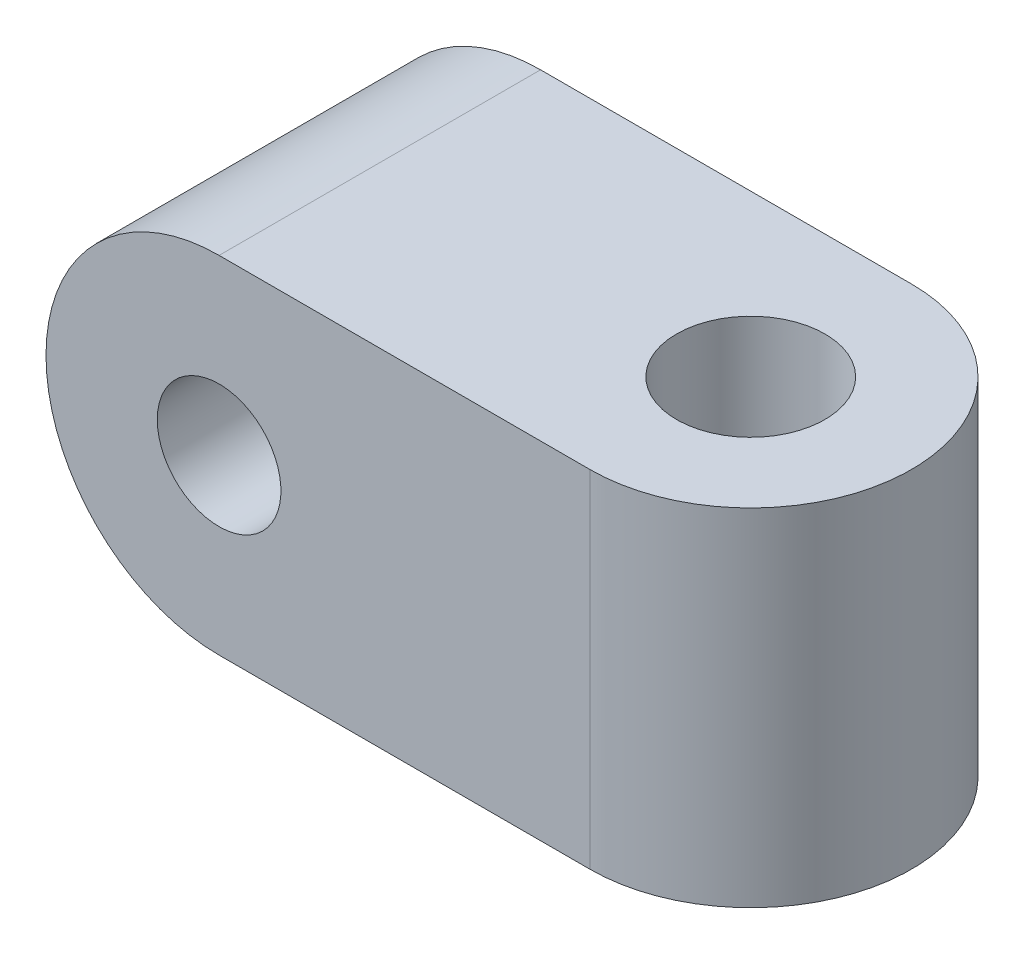
ISO-10303-21;
HEADER;
FILE_DESCRIPTION(('STEP AP214'),'2;1');
FILE_NAME('part.step','',(''),(''),'','','');
FILE_SCHEMA(('AUTOMOTIVE_DESIGN { 1 0 10303 214 1 1 1 1 }'));
ENDSEC;
DATA;
#1=APPLICATION_CONTEXT('core data for automotive mechanical design processes');
#2=APPLICATION_PROTOCOL_DEFINITION('international standard','automotive_design',2000,#1);
#3=PRODUCT_CONTEXT('',#1,'mechanical');
#4=PRODUCT('Part','Part','',(#3));
#5=PRODUCT_RELATED_PRODUCT_CATEGORY('part','',(#4));
#6=PRODUCT_DEFINITION_FORMATION('','',#4);
#7=PRODUCT_DEFINITION_CONTEXT('part definition',#1,'design');
#8=PRODUCT_DEFINITION('design','',#6,#7);
#9=PRODUCT_DEFINITION_SHAPE('','',#8);
#10=(LENGTH_UNIT() NAMED_UNIT(*) SI_UNIT(.MILLI.,.METRE.));
#11=(NAMED_UNIT(*) PLANE_ANGLE_UNIT() SI_UNIT($,.RADIAN.));
#12=(NAMED_UNIT(*) SI_UNIT($,.STERADIAN.) SOLID_ANGLE_UNIT());
#13=UNCERTAINTY_MEASURE_WITH_UNIT(LENGTH_MEASURE(1.E-05),#10,'distance_accuracy_value','');
#14=(GEOMETRIC_REPRESENTATION_CONTEXT(3) GLOBAL_UNCERTAINTY_ASSIGNED_CONTEXT((#13)) GLOBAL_UNIT_ASSIGNED_CONTEXT((#10,
#11,#12)) REPRESENTATION_CONTEXT('',''));
#15=CARTESIAN_POINT('',(0.,0.,0.));
#16=DIRECTION('',(0.,0.,1.));
#17=DIRECTION('',(1.,0.,0.));
#18=AXIS2_PLACEMENT_3D('',#15,#16,#17);
#19=CARTESIAN_POINT('',(0.,0.,6.5));
#20=DIRECTION('',(0.,0.,-1.));
#21=DIRECTION('',(-1.,0.,0.));
#22=AXIS2_PLACEMENT_3D('',#19,#20,#21);
#23=CYLINDRICAL_SURFACE('',#22,3.5);
#24=CARTESIAN_POINT('',(0.,0.,0.));
#25=DIRECTION('',(0.,0.,1.));
#26=DIRECTION('',(1.,0.,0.));
#27=AXIS2_PLACEMENT_3D('',#24,#25,#26);
#28=CIRCLE('',#27,3.5);
#29=CARTESIAN_POINT('',(0.,3.5,0.));
#30=VERTEX_POINT('',#29);
#31=CARTESIAN_POINT('',(0.,-3.5,0.));
#32=VERTEX_POINT('',#31);
#33=EDGE_CURVE('E93',#30,#32,#28,.T.);
#34=ORIENTED_EDGE('',*,*,#33,.T.);
#35=DIRECTION('',(0.,0.,-1.));
#36=VECTOR('',#35,1.);
#37=CARTESIAN_POINT('',(0.,-3.5,6.5));
#38=LINE('',#37,#36);
#39=CARTESIAN_POINT('',(0.,-3.5,6.5));
#40=VERTEX_POINT('',#39);
#41=EDGE_CURVE('E13',#40,#32,#38,.T.);
#42=ORIENTED_EDGE('',*,*,#41,.F.);
#43=CARTESIAN_POINT('',(0.,0.,6.5));
#44=DIRECTION('',(0.,0.,1.));
#45=DIRECTION('',(1.,0.,0.));
#46=AXIS2_PLACEMENT_3D('',#43,#44,#45);
#47=CIRCLE('',#46,3.5);
#48=CARTESIAN_POINT('',(0.,3.5,6.5));
#49=VERTEX_POINT('',#48);
#50=EDGE_CURVE('E122',#49,#40,#47,.T.);
#51=ORIENTED_EDGE('',*,*,#50,.F.);
#52=DIRECTION('',(0.,0.,-1.));
#53=VECTOR('',#52,1.);
#54=CARTESIAN_POINT('',(0.,3.5,6.5));
#55=LINE('',#54,#53);
#56=EDGE_CURVE('E55',#49,#30,#55,.T.);
#57=ORIENTED_EDGE('',*,*,#56,.T.);
#58=EDGE_LOOP('',(#34,#42,#51,#57));
#59=FACE_BOUND('',#58,.T.);
#60=ADVANCED_FACE('F46',(#59),#23,.T.);
#61=CARTESIAN_POINT('',(0.,-3.5,6.5));
#62=DIRECTION('',(0.,-1.,0.));
#63=DIRECTION('',(1.,0.,0.));
#64=AXIS2_PLACEMENT_3D('',#61,#62,#63);
#65=PLANE('',#64);
#66=DIRECTION('',(-1.,0.,0.));
#67=VECTOR('',#66,1.);
#68=CARTESIAN_POINT('',(0.,-3.5,0.));
#69=LINE('',#68,#67);
#70=CARTESIAN_POINT('',(7.5,-3.5,0.));
#71=VERTEX_POINT('',#70);
#72=EDGE_CURVE('E78',#71,#32,#69,.T.);
#73=ORIENTED_EDGE('',*,*,#72,.F.);
#74=CARTESIAN_POINT('',(7.5,-3.5,3.25));
#75=DIRECTION('',(0.,1.,0.));
#76=DIRECTION('',(-1.,0.,0.));
#77=AXIS2_PLACEMENT_3D('',#74,#75,#76);
#78=CIRCLE('',#77,3.25);
#79=CARTESIAN_POINT('',(7.5,-3.5,6.5));
#80=VERTEX_POINT('',#79);
#81=EDGE_CURVE('E102',#80,#71,#78,.T.);
#82=ORIENTED_EDGE('',*,*,#81,.F.);
#83=DIRECTION('',(-1.,0.,0.));
#84=VECTOR('',#83,1.);
#85=CARTESIAN_POINT('',(0.,-3.5,6.5));
#86=LINE('',#85,#84);
#87=EDGE_CURVE('E124',#80,#40,#86,.T.);
#88=ORIENTED_EDGE('',*,*,#87,.T.);
#89=ORIENTED_EDGE('',*,*,#41,.T.);
#90=EDGE_LOOP('',(#73,#82,#88,#89));
#91=FACE_BOUND('',#90,.T.);
#92=CARTESIAN_POINT('',(7.5,-3.5,3.25));
#93=DIRECTION('',(0.,1.,0.));
#94=DIRECTION('',(-1.,0.,0.));
#95=AXIS2_PLACEMENT_3D('',#92,#93,#94);
#96=CIRCLE('',#95,1.5);
#97=CARTESIAN_POINT('',(6.,-3.5,3.25));
#98=VERTEX_POINT('',#97);
#99=EDGE_CURVE('E116',#98,#98,#96,.T.);
#100=ORIENTED_EDGE('',*,*,#99,.T.);
#101=EDGE_LOOP('',(#100));
#102=FACE_BOUND('',#101,.T.);
#103=ADVANCED_FACE('F133',(#91,#102),#65,.T.);
#104=CARTESIAN_POINT('',(0.,0.,6.5));
#105=DIRECTION('',(0.,0.,-1.));
#106=DIRECTION('',(-1.,0.,0.));
#107=AXIS2_PLACEMENT_3D('',#104,#105,#106);
#108=CYLINDRICAL_SURFACE('',#107,1.25);
#109=CARTESIAN_POINT('',(0.,0.,6.5));
#110=DIRECTION('',(0.,0.,1.));
#111=DIRECTION('',(1.,0.,0.));
#112=AXIS2_PLACEMENT_3D('',#109,#110,#111);
#113=CIRCLE('',#112,1.25);
#114=CARTESIAN_POINT('',(-1.25,0.,6.5));
#115=VERTEX_POINT('',#114);
#116=EDGE_CURVE('E95',#115,#115,#113,.T.);
#117=CARTESIAN_POINT('',(0.,0.,0.));
#118=DIRECTION('',(0.,0.,1.));
#119=DIRECTION('',(1.,0.,0.));
#120=AXIS2_PLACEMENT_3D('',#117,#118,#119);
#121=CIRCLE('',#120,1.25);
#122=CARTESIAN_POINT('',(-1.25,0.,0.));
#123=VERTEX_POINT('',#122);
#124=EDGE_CURVE('E103',#123,#123,#121,.T.);
#125=CARTESIAN_POINT('',(-1.25,0.,6.5));
#126=CARTESIAN_POINT('',(-1.25,0.,6.43229166666667));
#127=CARTESIAN_POINT('',(-1.25,0.,6.36458333333333));
#128=CARTESIAN_POINT('',(-1.25,0.,6.22916666666667));
#129=CARTESIAN_POINT('',(-1.25,0.,6.16145833333333));
#130=CARTESIAN_POINT('',(-1.25,0.,6.02604166666667));
#131=CARTESIAN_POINT('',(-1.25,0.,5.95833333333333));
#132=CARTESIAN_POINT('',(-1.25,0.,5.82291666666667));
#133=CARTESIAN_POINT('',(-1.25,0.,5.75520833333333));
#134=CARTESIAN_POINT('',(-1.25,0.,5.61979166666667));
#135=CARTESIAN_POINT('',(-1.25,0.,5.55208333333333));
#136=CARTESIAN_POINT('',(-1.25,0.,5.41666666666667));
#137=CARTESIAN_POINT('',(-1.25,0.,5.34895833333333));
#138=CARTESIAN_POINT('',(-1.25,0.,5.21354166666667));
#139=CARTESIAN_POINT('',(-1.25,0.,5.14583333333333));
#140=CARTESIAN_POINT('',(-1.25,0.,5.01041666666667));
#141=CARTESIAN_POINT('',(-1.25,0.,4.94270833333333));
#142=CARTESIAN_POINT('',(-1.25,0.,4.80729166666667));
#143=CARTESIAN_POINT('',(-1.25,0.,4.73958333333333));
#144=CARTESIAN_POINT('',(-1.25,0.,4.60416666666667));
#145=CARTESIAN_POINT('',(-1.25,0.,4.53645833333333));
#146=CARTESIAN_POINT('',(-1.25,0.,4.40104166666667));
#147=CARTESIAN_POINT('',(-1.25,0.,4.33333333333333));
#148=CARTESIAN_POINT('',(-1.25,0.,4.19791666666667));
#149=CARTESIAN_POINT('',(-1.25,0.,4.13020833333333));
#150=CARTESIAN_POINT('',(-1.25,0.,3.99479166666667));
#151=CARTESIAN_POINT('',(-1.25,0.,3.92708333333333));
#152=CARTESIAN_POINT('',(-1.25,0.,3.79166666666667));
#153=CARTESIAN_POINT('',(-1.25,0.,3.72395833333333));
#154=CARTESIAN_POINT('',(-1.25,0.,3.58854166666667));
#155=CARTESIAN_POINT('',(-1.25,0.,3.52083333333333));
#156=CARTESIAN_POINT('',(-1.25,0.,3.38541666666667));
#157=CARTESIAN_POINT('',(-1.25,0.,3.31770833333333));
#158=CARTESIAN_POINT('',(-1.25,0.,3.18229166666667));
#159=CARTESIAN_POINT('',(-1.25,0.,3.11458333333333));
#160=CARTESIAN_POINT('',(-1.25,0.,2.97916666666667));
#161=CARTESIAN_POINT('',(-1.25,0.,2.91145833333333));
#162=CARTESIAN_POINT('',(-1.25,0.,2.77604166666667));
#163=CARTESIAN_POINT('',(-1.25,0.,2.70833333333333));
#164=CARTESIAN_POINT('',(-1.25,0.,2.57291666666667));
#165=CARTESIAN_POINT('',(-1.25,0.,2.50520833333333));
#166=CARTESIAN_POINT('',(-1.25,0.,2.36979166666667));
#167=CARTESIAN_POINT('',(-1.25,0.,2.30208333333333));
#168=CARTESIAN_POINT('',(-1.25,0.,2.16666666666667));
#169=CARTESIAN_POINT('',(-1.25,0.,2.09895833333333));
#170=CARTESIAN_POINT('',(-1.25,0.,1.96354166666667));
#171=CARTESIAN_POINT('',(-1.25,0.,1.89583333333333));
#172=CARTESIAN_POINT('',(-1.25,0.,1.76041666666667));
#173=CARTESIAN_POINT('',(-1.25,0.,1.69270833333333));
#174=CARTESIAN_POINT('',(-1.25,0.,1.55729166666667));
#175=CARTESIAN_POINT('',(-1.25,0.,1.48958333333333));
#176=CARTESIAN_POINT('',(-1.25,0.,1.35416666666667));
#177=CARTESIAN_POINT('',(-1.25,0.,1.28645833333333));
#178=CARTESIAN_POINT('',(-1.25,0.,1.15104166666667));
#179=CARTESIAN_POINT('',(-1.25,0.,1.08333333333333));
#180=CARTESIAN_POINT('',(-1.25,0.,0.947916666666667));
#181=CARTESIAN_POINT('',(-1.25,0.,0.880208333333333));
#182=CARTESIAN_POINT('',(-1.25,0.,0.744791666666667));
#183=CARTESIAN_POINT('',(-1.25,0.,0.677083333333333));
#184=CARTESIAN_POINT('',(-1.25,0.,0.541666666666667));
#185=CARTESIAN_POINT('',(-1.25,0.,0.473958333333333));
#186=CARTESIAN_POINT('',(-1.25,0.,0.338541666666667));
#187=CARTESIAN_POINT('',(-1.25,0.,0.270833333333334));
#188=CARTESIAN_POINT('',(-1.25,0.,0.135416666666667));
#189=CARTESIAN_POINT('',(-1.25,0.,0.0677083333333334));
#190=CARTESIAN_POINT('',(-1.25,0.,0.));
#191=B_SPLINE_CURVE_WITH_KNOTS('',3,(#125,#126,#127,#128,#129,#130,#131,#132,#133,#134,#135,
#136,#137,#138,#139,#140,#141,#142,#143,#144,#145,#146,#147,#148,#149,#150,#151,#152,#153,#154,
#155,#156,#157,#158,#159,#160,#161,#162,#163,#164,#165,#166,#167,#168,#169,#170,#171,#172,#173,
#174,#175,#176,#177,#178,#179,#180,#181,#182,#183,#184,#185,#186,#187,#188,#189,#190),
.UNSPECIFIED.,.F.,.F.,(4,2,2,2,2,2,2,2,2,2,2,2,2,2,2,2,2,2,2,2,2,2,2,2,2,2,2,2,2,2,2,2,4),(0.,
0.203124999999999,0.40625,0.609375,0.812499999999999,1.015625,1.21875,1.421875,1.625,1.828125,
2.03125,2.234375,2.4375,2.640625,2.84375,3.046875,3.25,3.453125,3.65625,3.859375,4.0625,
4.265625,4.46875,4.671875,4.875,5.078125,5.28125,5.484375,5.6875,5.890625,6.09375,6.296875,6.5),.UNSPECIFIED.);
#192=EDGE_CURVE('BSEAM48',#115,#123,#191,.T.);
#193=ORIENTED_EDGE('',*,*,#116,.T.);
#194=ORIENTED_EDGE('',*,*,#124,.F.);
#195=ORIENTED_EDGE('',*,*,#192,.T.);
#196=ORIENTED_EDGE('',*,*,#192,.F.);
#197=EDGE_LOOP('',(#193,#195,#194,#196));
#198=FACE_BOUND('',#197,.T.);
#199=ADVANCED_FACE('F48',(#198),#108,.F.);
#200=CARTESIAN_POINT('',(0.,3.5,6.5));
#201=DIRECTION('',(0.,1.,0.));
#202=DIRECTION('',(-1.,0.,0.));
#203=AXIS2_PLACEMENT_3D('',#200,#201,#202);
#204=PLANE('',#203);
#205=DIRECTION('',(1.,0.,0.));
#206=VECTOR('',#205,1.);
#207=CARTESIAN_POINT('',(0.,3.5,0.));
#208=LINE('',#207,#206);
#209=CARTESIAN_POINT('',(7.5,3.5,0.));
#210=VERTEX_POINT('',#209);
#211=EDGE_CURVE('E88',#30,#210,#208,.T.);
#212=ORIENTED_EDGE('',*,*,#211,.F.);
#213=ORIENTED_EDGE('',*,*,#56,.F.);
#214=DIRECTION('',(1.,0.,0.));
#215=VECTOR('',#214,1.);
#216=CARTESIAN_POINT('',(0.,3.5,6.5));
#217=LINE('',#216,#215);
#218=CARTESIAN_POINT('',(7.5,3.5,6.5));
#219=VERTEX_POINT('',#218);
#220=EDGE_CURVE('E109',#49,#219,#217,.T.);
#221=ORIENTED_EDGE('',*,*,#220,.T.);
#222=CARTESIAN_POINT('',(7.5,3.5,3.25));
#223=DIRECTION('',(0.,1.,0.));
#224=DIRECTION('',(-1.,0.,0.));
#225=AXIS2_PLACEMENT_3D('',#222,#223,#224);
#226=CIRCLE('',#225,3.25);
#227=EDGE_CURVE('E101',#219,#210,#226,.T.);
#228=ORIENTED_EDGE('',*,*,#227,.T.);
#229=EDGE_LOOP('',(#212,#213,#221,#228));
#230=FACE_BOUND('',#229,.T.);
#231=CARTESIAN_POINT('',(7.5,3.5,3.25));
#232=DIRECTION('',(0.,1.,0.));
#233=DIRECTION('',(-1.,0.,0.));
#234=AXIS2_PLACEMENT_3D('',#231,#232,#233);
#235=CIRCLE('',#234,1.5);
#236=CARTESIAN_POINT('',(6.,3.5,3.25));
#237=VERTEX_POINT('',#236);
#238=EDGE_CURVE('E111',#237,#237,#235,.T.);
#239=ORIENTED_EDGE('',*,*,#238,.F.);
#240=EDGE_LOOP('',(#239));
#241=FACE_BOUND('',#240,.T.);
#242=ADVANCED_FACE('F106',(#230,#241),#204,.T.);
#243=CARTESIAN_POINT('',(0.,0.,6.5));
#244=DIRECTION('',(0.,0.,1.));
#245=DIRECTION('',(1.,0.,0.));
#246=AXIS2_PLACEMENT_3D('',#243,#244,#245);
#247=PLANE('',#246);
#248=ORIENTED_EDGE('',*,*,#116,.F.);
#249=EDGE_LOOP('',(#248));
#250=FACE_BOUND('',#249,.T.);
#251=ORIENTED_EDGE('',*,*,#50,.T.);
#252=ORIENTED_EDGE('',*,*,#87,.F.);
#253=DIRECTION('',(0.,1.,0.));
#254=VECTOR('',#253,1.);
#255=CARTESIAN_POINT('',(7.5,-3.5,6.5));
#256=LINE('',#255,#254);
#257=EDGE_CURVE('E104',#80,#219,#256,.T.);
#258=ORIENTED_EDGE('',*,*,#257,.T.);
#259=ORIENTED_EDGE('',*,*,#220,.F.);
#260=EDGE_LOOP('',(#251,#252,#258,#259));
#261=FACE_BOUND('',#260,.T.);
#262=ADVANCED_FACE('F132',(#250,#261),#247,.T.);
#263=CARTESIAN_POINT('',(0.,0.,0.));
#264=DIRECTION('',(0.,0.,1.));
#265=DIRECTION('',(1.,0.,0.));
#266=AXIS2_PLACEMENT_3D('',#263,#264,#265);
#267=PLANE('',#266);
#268=ORIENTED_EDGE('',*,*,#124,.T.);
#269=EDGE_LOOP('',(#268));
#270=FACE_BOUND('',#269,.T.);
#271=ORIENTED_EDGE('',*,*,#33,.F.);
#272=ORIENTED_EDGE('',*,*,#211,.T.);
#273=DIRECTION('',(0.,1.,0.));
#274=VECTOR('',#273,1.);
#275=CARTESIAN_POINT('',(7.5,-3.5,0.));
#276=LINE('',#275,#274);
#277=EDGE_CURVE('E91',#71,#210,#276,.T.);
#278=ORIENTED_EDGE('',*,*,#277,.F.);
#279=ORIENTED_EDGE('',*,*,#72,.T.);
#280=EDGE_LOOP('',(#271,#272,#278,#279));
#281=FACE_BOUND('',#280,.T.);
#282=ADVANCED_FACE('F90',(#270,#281),#267,.F.);
#283=CARTESIAN_POINT('',(7.5,-3.5,3.25));
#284=DIRECTION('',(0.,1.,0.));
#285=DIRECTION('',(-1.,0.,0.));
#286=AXIS2_PLACEMENT_3D('',#283,#284,#285);
#287=CYLINDRICAL_SURFACE('',#286,3.25);
#288=ORIENTED_EDGE('',*,*,#227,.F.);
#289=ORIENTED_EDGE('',*,*,#257,.F.);
#290=ORIENTED_EDGE('',*,*,#81,.T.);
#291=ORIENTED_EDGE('',*,*,#277,.T.);
#292=EDGE_LOOP('',(#288,#289,#290,#291));
#293=FACE_BOUND('',#292,.T.);
#294=ADVANCED_FACE('F99',(#293),#287,.T.);
#295=CARTESIAN_POINT('',(7.5,-3.5,3.25));
#296=DIRECTION('',(0.,1.,0.));
#297=DIRECTION('',(-1.,0.,0.));
#298=AXIS2_PLACEMENT_3D('',#295,#296,#297);
#299=CYLINDRICAL_SURFACE('',#298,1.5);
#300=ORIENTED_EDGE('',*,*,#99,.F.);
#301=EDGE_LOOP('',(#300));
#302=FACE_BOUND('',#301,.T.);
#303=ORIENTED_EDGE('',*,*,#238,.T.);
#304=EDGE_LOOP('',(#303));
#305=FACE_BOUND('',#304,.T.);
#306=ADVANCED_FACE('F138',(#302,#305),#299,.F.);
#307=CLOSED_SHELL('',(#60,#103,#199,#242,#262,#282,#294,#306));
#308=MANIFOLD_SOLID_BREP('B2',#307);
#309=ADVANCED_BREP_SHAPE_REPRESENTATION('',(#18,#308),#14);
#310=SHAPE_DEFINITION_REPRESENTATION(#9,#309);
ENDSEC;
END-ISO-10303-21;
